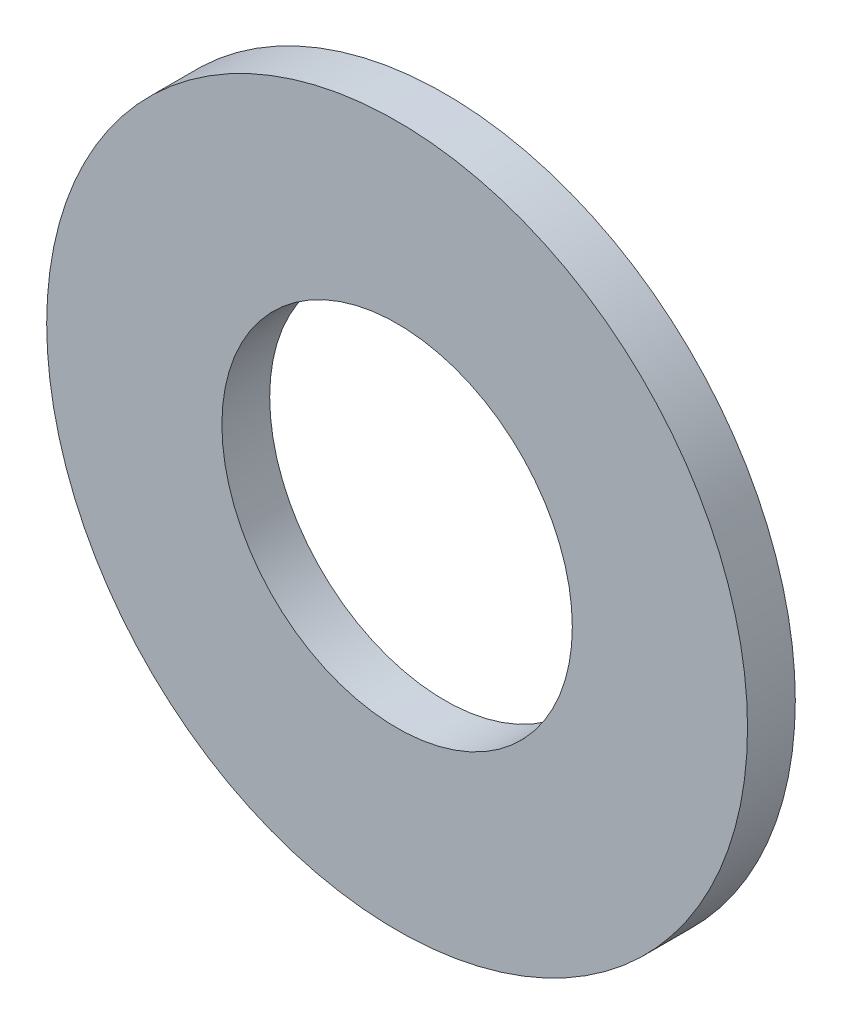
ISO-10303-21;
HEADER;
FILE_DESCRIPTION(('STEP AP214'),'2;1');
FILE_NAME('part.step','',(''),(''),'','','');
FILE_SCHEMA(('AUTOMOTIVE_DESIGN { 1 0 10303 214 1 1 1 1 }'));
ENDSEC;
DATA;
#1=APPLICATION_CONTEXT('core data for automotive mechanical design processes');
#2=APPLICATION_PROTOCOL_DEFINITION('international standard','automotive_design',2000,#1);
#3=PRODUCT_CONTEXT('',#1,'mechanical');
#4=PRODUCT('Part','Part','',(#3));
#5=PRODUCT_RELATED_PRODUCT_CATEGORY('part','',(#4));
#6=PRODUCT_DEFINITION_FORMATION('','',#4);
#7=PRODUCT_DEFINITION_CONTEXT('part definition',#1,'design');
#8=PRODUCT_DEFINITION('design','',#6,#7);
#9=PRODUCT_DEFINITION_SHAPE('','',#8);
#10=(LENGTH_UNIT() NAMED_UNIT(*) SI_UNIT(.MILLI.,.METRE.));
#11=(NAMED_UNIT(*) PLANE_ANGLE_UNIT() SI_UNIT($,.RADIAN.));
#12=(NAMED_UNIT(*) SI_UNIT($,.STERADIAN.) SOLID_ANGLE_UNIT());
#13=UNCERTAINTY_MEASURE_WITH_UNIT(LENGTH_MEASURE(1.E-05),#10,'distance_accuracy_value','');
#14=(GEOMETRIC_REPRESENTATION_CONTEXT(3) GLOBAL_UNCERTAINTY_ASSIGNED_CONTEXT((#13)) GLOBAL_UNIT_ASSIGNED_CONTEXT((#10,
#11,#12)) REPRESENTATION_CONTEXT('',''));
#15=CARTESIAN_POINT('',(0.,0.,0.));
#16=DIRECTION('',(0.,0.,1.));
#17=DIRECTION('',(1.,0.,0.));
#18=AXIS2_PLACEMENT_3D('',#15,#16,#17);
#19=CARTESIAN_POINT('',(0.,0.,1.5));
#20=DIRECTION('',(0.,0.,1.));
#21=DIRECTION('',(1.,0.,0.));
#22=AXIS2_PLACEMENT_3D('',#19,#20,#21);
#23=PLANE('',#22);
#24=CARTESIAN_POINT('',(0.,0.,1.5));
#25=DIRECTION('',(0.,0.,1.));
#26=DIRECTION('',(1.,0.,0.));
#27=AXIS2_PLACEMENT_3D('',#24,#25,#26);
#28=CIRCLE('',#27,11.);
#29=CARTESIAN_POINT('',(11.,0.,1.5));
#30=VERTEX_POINT('',#29);
#31=EDGE_CURVE('E10',#30,#30,#28,.T.);
#32=ORIENTED_EDGE('',*,*,#31,.T.);
#33=EDGE_LOOP('',(#32));
#34=FACE_BOUND('',#33,.T.);
#35=CARTESIAN_POINT('',(0.,0.,1.5));
#36=DIRECTION('',(0.,0.,1.));
#37=DIRECTION('',(1.,0.,0.));
#38=AXIS2_PLACEMENT_3D('',#35,#36,#37);
#39=CIRCLE('',#38,5.5);
#40=CARTESIAN_POINT('',(5.5,0.,1.5));
#41=VERTEX_POINT('',#40);
#42=EDGE_CURVE('E41',#41,#41,#39,.T.);
#43=ORIENTED_EDGE('',*,*,#42,.F.);
#44=EDGE_LOOP('',(#43));
#45=FACE_BOUND('',#44,.T.);
#46=ADVANCED_FACE('F30',(#34,#45),#23,.T.);
#47=CARTESIAN_POINT('',(0.,0.,0.));
#48=DIRECTION('',(0.,0.,1.));
#49=DIRECTION('',(1.,0.,0.));
#50=AXIS2_PLACEMENT_3D('',#47,#48,#49);
#51=PLANE('',#50);
#52=CARTESIAN_POINT('',(0.,0.,0.));
#53=DIRECTION('',(0.,0.,1.));
#54=DIRECTION('',(1.,0.,0.));
#55=AXIS2_PLACEMENT_3D('',#52,#53,#54);
#56=CIRCLE('',#55,11.);
#57=CARTESIAN_POINT('',(11.,0.,0.));
#58=VERTEX_POINT('',#57);
#59=EDGE_CURVE('E34',#58,#58,#56,.T.);
#60=ORIENTED_EDGE('',*,*,#59,.F.);
#61=EDGE_LOOP('',(#60));
#62=FACE_BOUND('',#61,.T.);
#63=CARTESIAN_POINT('',(0.,0.,0.));
#64=DIRECTION('',(0.,0.,1.));
#65=DIRECTION('',(1.,0.,0.));
#66=AXIS2_PLACEMENT_3D('',#63,#64,#65);
#67=CIRCLE('',#66,5.5);
#68=CARTESIAN_POINT('',(5.5,0.,0.));
#69=VERTEX_POINT('',#68);
#70=EDGE_CURVE('E43',#69,#69,#67,.T.);
#71=ORIENTED_EDGE('',*,*,#70,.T.);
#72=EDGE_LOOP('',(#71));
#73=FACE_BOUND('',#72,.T.);
#74=ADVANCED_FACE('F53',(#62,#73),#51,.F.);
#75=CARTESIAN_POINT('',(0.,0.,1.5));
#76=DIRECTION('',(0.,0.,-1.));
#77=DIRECTION('',(-1.,0.,0.));
#78=AXIS2_PLACEMENT_3D('',#75,#76,#77);
#79=CYLINDRICAL_SURFACE('',#78,11.);
#80=ORIENTED_EDGE('',*,*,#31,.F.);
#81=EDGE_LOOP('',(#80));
#82=FACE_BOUND('',#81,.T.);
#83=ORIENTED_EDGE('',*,*,#59,.T.);
#84=EDGE_LOOP('',(#83));
#85=FACE_BOUND('',#84,.T.);
#86=ADVANCED_FACE('F32',(#82,#85),#79,.T.);
#87=CARTESIAN_POINT('',(0.,0.,1.5));
#88=DIRECTION('',(0.,0.,-1.));
#89=DIRECTION('',(-1.,0.,0.));
#90=AXIS2_PLACEMENT_3D('',#87,#88,#89);
#91=CYLINDRICAL_SURFACE('',#90,5.5);
#92=ORIENTED_EDGE('',*,*,#42,.T.);
#93=EDGE_LOOP('',(#92));
#94=FACE_BOUND('',#93,.T.);
#95=ORIENTED_EDGE('',*,*,#70,.F.);
#96=EDGE_LOOP('',(#95));
#97=FACE_BOUND('',#96,.T.);
#98=ADVANCED_FACE('F49',(#94,#97),#91,.F.);
#99=CLOSED_SHELL('',(#46,#74,#86,#98));
#100=MANIFOLD_SOLID_BREP('B2',#99);
#101=ADVANCED_BREP_SHAPE_REPRESENTATION('',(#18,#100),#14);
#102=SHAPE_DEFINITION_REPRESENTATION(#9,#101);
ENDSEC;
END-ISO-10303-21;
